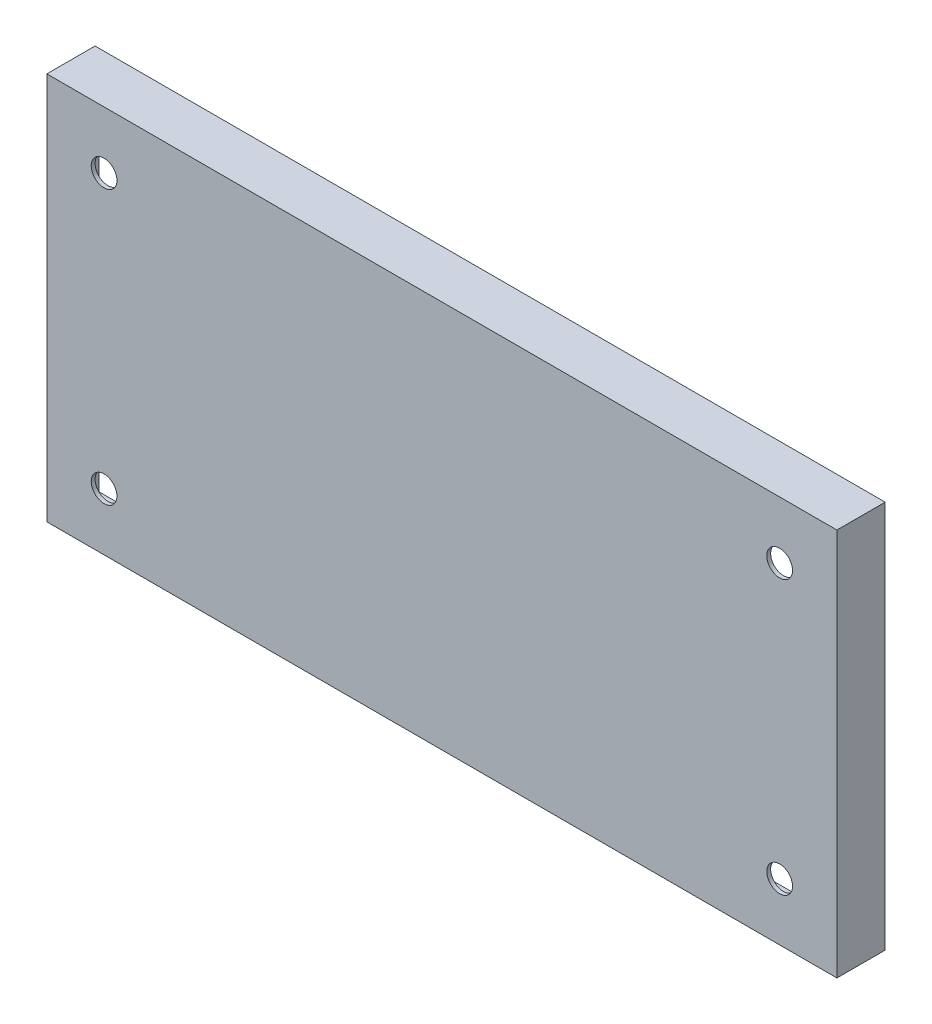
ISO-10303-21;
HEADER;
FILE_DESCRIPTION(('STEP AP214'),'2;1');
FILE_NAME('part.step','',(''),(''),'','','');
FILE_SCHEMA(('AUTOMOTIVE_DESIGN { 1 0 10303 214 1 1 1 1 }'));
ENDSEC;
DATA;
#1=APPLICATION_CONTEXT('core data for automotive mechanical design processes');
#2=APPLICATION_PROTOCOL_DEFINITION('international standard','automotive_design',2000,#1);
#3=PRODUCT_CONTEXT('',#1,'mechanical');
#4=PRODUCT('Part','Part','',(#3));
#5=PRODUCT_RELATED_PRODUCT_CATEGORY('part','',(#4));
#6=PRODUCT_DEFINITION_FORMATION('','',#4);
#7=PRODUCT_DEFINITION_CONTEXT('part definition',#1,'design');
#8=PRODUCT_DEFINITION('design','',#6,#7);
#9=PRODUCT_DEFINITION_SHAPE('','',#8);
#10=(LENGTH_UNIT() NAMED_UNIT(*) SI_UNIT(.MILLI.,.METRE.));
#11=(NAMED_UNIT(*) PLANE_ANGLE_UNIT() SI_UNIT($,.RADIAN.));
#12=(NAMED_UNIT(*) SI_UNIT($,.STERADIAN.) SOLID_ANGLE_UNIT());
#13=UNCERTAINTY_MEASURE_WITH_UNIT(LENGTH_MEASURE(1.E-05),#10,'distance_accuracy_value','');
#14=(GEOMETRIC_REPRESENTATION_CONTEXT(3) GLOBAL_UNCERTAINTY_ASSIGNED_CONTEXT((#13)) GLOBAL_UNIT_ASSIGNED_CONTEXT((#10,
#11,#12)) REPRESENTATION_CONTEXT('',''));
#15=CARTESIAN_POINT('',(0.,0.,0.));
#16=DIRECTION('',(0.,0.,1.));
#17=DIRECTION('',(1.,0.,0.));
#18=AXIS2_PLACEMENT_3D('',#15,#16,#17);
#19=CARTESIAN_POINT('',(-122.8,-60.3,15.));
#20=DIRECTION('',(0.,1.,0.));
#21=DIRECTION('',(-1.,0.,0.));
#22=AXIS2_PLACEMENT_3D('',#19,#20,#21);
#23=PLANE('',#22);
#24=DIRECTION('',(1.,0.,0.));
#25=VECTOR('',#24,1.);
#26=CARTESIAN_POINT('',(-122.8,-60.3,0.));
#27=LINE('',#26,#25);
#28=CARTESIAN_POINT('',(-122.8,-60.3,0.));
#29=VERTEX_POINT('',#28);
#30=CARTESIAN_POINT('',(122.8,-60.3,0.));
#31=VERTEX_POINT('',#30);
#32=EDGE_CURVE('E135',#29,#31,#27,.T.);
#33=ORIENTED_EDGE('',*,*,#32,.T.);
#34=DIRECTION('',(0.,0.,-1.));
#35=VECTOR('',#34,1.);
#36=CARTESIAN_POINT('',(122.8,-60.3,15.));
#37=LINE('',#36,#35);
#38=CARTESIAN_POINT('',(122.8,-60.3,15.));
#39=VERTEX_POINT('',#38);
#40=EDGE_CURVE('E11',#39,#31,#37,.T.);
#41=ORIENTED_EDGE('',*,*,#40,.F.);
#42=DIRECTION('',(1.,0.,0.));
#43=VECTOR('',#42,1.);
#44=CARTESIAN_POINT('',(-122.8,-60.3,15.));
#45=LINE('',#44,#43);
#46=CARTESIAN_POINT('',(-122.8,-60.3,15.));
#47=VERTEX_POINT('',#46);
#48=EDGE_CURVE('E159',#47,#39,#45,.T.);
#49=ORIENTED_EDGE('',*,*,#48,.F.);
#50=DIRECTION('',(0.,0.,-1.));
#51=VECTOR('',#50,1.);
#52=CARTESIAN_POINT('',(-122.8,-60.3,15.));
#53=LINE('',#52,#51);
#54=EDGE_CURVE('E164',#47,#29,#53,.T.);
#55=ORIENTED_EDGE('',*,*,#54,.T.);
#56=EDGE_LOOP('',(#33,#41,#49,#55));
#57=FACE_BOUND('',#56,.T.);
#58=ADVANCED_FACE('F37',(#57),#23,.F.);
#59=CARTESIAN_POINT('',(122.8,-60.3,15.));
#60=DIRECTION('',(-1.,0.,0.));
#61=DIRECTION('',(0.,0.,1.));
#62=AXIS2_PLACEMENT_3D('',#59,#60,#61);
#63=PLANE('',#62);
#64=DIRECTION('',(0.,1.,0.));
#65=VECTOR('',#64,1.);
#66=CARTESIAN_POINT('',(122.8,-60.3,0.));
#67=LINE('',#66,#65);
#68=CARTESIAN_POINT('',(122.8,60.3,0.));
#69=VERTEX_POINT('',#68);
#70=EDGE_CURVE('E139',#31,#69,#67,.T.);
#71=ORIENTED_EDGE('',*,*,#70,.T.);
#72=DIRECTION('',(0.,0.,-1.));
#73=VECTOR('',#72,1.);
#74=CARTESIAN_POINT('',(122.8,60.3,15.));
#75=LINE('',#74,#73);
#76=CARTESIAN_POINT('',(122.8,60.3,15.));
#77=VERTEX_POINT('',#76);
#78=EDGE_CURVE('E45',#77,#69,#75,.T.);
#79=ORIENTED_EDGE('',*,*,#78,.F.);
#80=DIRECTION('',(0.,1.,0.));
#81=VECTOR('',#80,1.);
#82=CARTESIAN_POINT('',(122.8,-60.3,15.));
#83=LINE('',#82,#81);
#84=EDGE_CURVE('E90',#39,#77,#83,.T.);
#85=ORIENTED_EDGE('',*,*,#84,.F.);
#86=ORIENTED_EDGE('',*,*,#40,.T.);
#87=EDGE_LOOP('',(#71,#79,#85,#86));
#88=FACE_BOUND('',#87,.T.);
#89=ADVANCED_FACE('F203',(#88),#63,.F.);
#90=CARTESIAN_POINT('',(-122.8,60.3,15.));
#91=DIRECTION('',(0.,-1.,0.));
#92=DIRECTION('',(1.,0.,0.));
#93=AXIS2_PLACEMENT_3D('',#90,#91,#92);
#94=PLANE('',#93);
#95=DIRECTION('',(-1.,0.,0.));
#96=VECTOR('',#95,1.);
#97=CARTESIAN_POINT('',(-122.8,60.3,0.));
#98=LINE('',#97,#96);
#99=CARTESIAN_POINT('',(-122.8,60.3,0.));
#100=VERTEX_POINT('',#99);
#101=EDGE_CURVE('E167',#69,#100,#98,.T.);
#102=ORIENTED_EDGE('',*,*,#101,.T.);
#103=DIRECTION('',(0.,0.,-1.));
#104=VECTOR('',#103,1.);
#105=CARTESIAN_POINT('',(-122.8,60.3,15.));
#106=LINE('',#105,#104);
#107=CARTESIAN_POINT('',(-122.8,60.3,15.));
#108=VERTEX_POINT('',#107);
#109=EDGE_CURVE('E171',#108,#100,#106,.T.);
#110=ORIENTED_EDGE('',*,*,#109,.F.);
#111=DIRECTION('',(-1.,0.,0.));
#112=VECTOR('',#111,1.);
#113=CARTESIAN_POINT('',(-122.8,60.3,15.));
#114=LINE('',#113,#112);
#115=EDGE_CURVE('E162',#77,#108,#114,.T.);
#116=ORIENTED_EDGE('',*,*,#115,.F.);
#117=ORIENTED_EDGE('',*,*,#78,.T.);
#118=EDGE_LOOP('',(#102,#110,#116,#117));
#119=FACE_BOUND('',#118,.T.);
#120=ADVANCED_FACE('F208',(#119),#94,.F.);
#121=CARTESIAN_POINT('',(-122.8,-60.3,15.));
#122=DIRECTION('',(1.,0.,0.));
#123=DIRECTION('',(0.,1.,0.));
#124=AXIS2_PLACEMENT_3D('',#121,#122,#123);
#125=PLANE('',#124);
#126=DIRECTION('',(0.,-1.,0.));
#127=VECTOR('',#126,1.);
#128=CARTESIAN_POINT('',(-122.8,-60.3,0.));
#129=LINE('',#128,#127);
#130=EDGE_CURVE('E83',#100,#29,#129,.T.);
#131=ORIENTED_EDGE('',*,*,#130,.T.);
#132=ORIENTED_EDGE('',*,*,#54,.F.);
#133=DIRECTION('',(0.,-1.,0.));
#134=VECTOR('',#133,1.);
#135=CARTESIAN_POINT('',(-122.8,-60.3,15.));
#136=LINE('',#135,#134);
#137=EDGE_CURVE('E62',#108,#47,#136,.T.);
#138=ORIENTED_EDGE('',*,*,#137,.F.);
#139=ORIENTED_EDGE('',*,*,#109,.T.);
#140=EDGE_LOOP('',(#131,#132,#138,#139));
#141=FACE_BOUND('',#140,.T.);
#142=ADVANCED_FACE('F196',(#141),#125,.F.);
#143=CARTESIAN_POINT('',(0.,0.,15.));
#144=DIRECTION('',(0.,0.,1.));
#145=DIRECTION('',(1.,0.,0.));
#146=AXIS2_PLACEMENT_3D('',#143,#144,#145);
#147=PLANE('',#146);
#148=CARTESIAN_POINT('',(105.,42.5,15.));
#149=DIRECTION('',(0.,0.,1.));
#150=DIRECTION('',(-1.,0.,0.));
#151=AXIS2_PLACEMENT_3D('',#148,#149,#150);
#152=CIRCLE('',#151,4.00000000000001);
#153=CARTESIAN_POINT('',(101.,42.5,15.));
#154=VERTEX_POINT('',#153);
#155=EDGE_CURVE('E180',#154,#154,#152,.T.);
#156=ORIENTED_EDGE('',*,*,#155,.F.);
#157=EDGE_LOOP('',(#156));
#158=FACE_BOUND('',#157,.T.);
#159=CARTESIAN_POINT('',(105.,-42.5,15.));
#160=DIRECTION('',(0.,0.,1.));
#161=DIRECTION('',(1.,0.,0.));
#162=AXIS2_PLACEMENT_3D('',#159,#160,#161);
#163=CIRCLE('',#162,4.00000000000001);
#164=CARTESIAN_POINT('',(109.,-42.5,15.));
#165=VERTEX_POINT('',#164);
#166=EDGE_CURVE('E327',#165,#165,#163,.T.);
#167=ORIENTED_EDGE('',*,*,#166,.F.);
#168=EDGE_LOOP('',(#167));
#169=FACE_BOUND('',#168,.T.);
#170=CARTESIAN_POINT('',(-105.,-42.5,15.));
#171=DIRECTION('',(0.,0.,1.));
#172=DIRECTION('',(-1.,0.,0.));
#173=AXIS2_PLACEMENT_3D('',#170,#171,#172);
#174=CIRCLE('',#173,4.00000000000001);
#175=CARTESIAN_POINT('',(-109.,-42.5,15.));
#176=VERTEX_POINT('',#175);
#177=EDGE_CURVE('E330',#176,#176,#174,.T.);
#178=ORIENTED_EDGE('',*,*,#177,.F.);
#179=EDGE_LOOP('',(#178));
#180=FACE_BOUND('',#179,.T.);
#181=CARTESIAN_POINT('',(-105.,42.5,15.));
#182=DIRECTION('',(0.,0.,1.));
#183=DIRECTION('',(1.,0.,0.));
#184=AXIS2_PLACEMENT_3D('',#181,#182,#183);
#185=CIRCLE('',#184,4.00000000000001);
#186=CARTESIAN_POINT('',(-101.,42.5,15.));
#187=VERTEX_POINT('',#186);
#188=EDGE_CURVE('E144',#187,#187,#185,.T.);
#189=ORIENTED_EDGE('',*,*,#188,.F.);
#190=EDGE_LOOP('',(#189));
#191=FACE_BOUND('',#190,.T.);
#192=ORIENTED_EDGE('',*,*,#48,.T.);
#193=ORIENTED_EDGE('',*,*,#84,.T.);
#194=ORIENTED_EDGE('',*,*,#115,.T.);
#195=ORIENTED_EDGE('',*,*,#137,.T.);
#196=EDGE_LOOP('',(#192,#193,#194,#195));
#197=FACE_BOUND('',#196,.T.);
#198=ADVANCED_FACE('F193',(#158,#169,#180,#191,#197),#147,.T.);
#199=CARTESIAN_POINT('',(0.,0.,0.));
#200=DIRECTION('',(0.,0.,1.));
#201=DIRECTION('',(1.,0.,0.));
#202=AXIS2_PLACEMENT_3D('',#199,#200,#201);
#203=PLANE('',#202);
#204=DIRECTION('',(0.,-1.,0.));
#205=VECTOR('',#204,1.);
#206=CARTESIAN_POINT('',(-121.6,-60.3,0.));
#207=LINE('',#206,#205);
#208=CARTESIAN_POINT('',(-121.6,59.1,0.));
#209=VERTEX_POINT('',#208);
#210=CARTESIAN_POINT('',(-121.6,-59.1,0.));
#211=VERTEX_POINT('',#210);
#212=EDGE_CURVE('E130',#209,#211,#207,.T.);
#213=ORIENTED_EDGE('',*,*,#212,.T.);
#214=DIRECTION('',(1.,0.,0.));
#215=VECTOR('',#214,1.);
#216=CARTESIAN_POINT('',(-122.8,-59.1,0.));
#217=LINE('',#216,#215);
#218=CARTESIAN_POINT('',(121.6,-59.1,0.));
#219=VERTEX_POINT('',#218);
#220=EDGE_CURVE('E152',#211,#219,#217,.T.);
#221=ORIENTED_EDGE('',*,*,#220,.T.);
#222=DIRECTION('',(0.,1.,0.));
#223=VECTOR('',#222,1.);
#224=CARTESIAN_POINT('',(121.6,-60.3,0.));
#225=LINE('',#224,#223);
#226=CARTESIAN_POINT('',(121.6,59.1,0.));
#227=VERTEX_POINT('',#226);
#228=EDGE_CURVE('E134',#219,#227,#225,.T.);
#229=ORIENTED_EDGE('',*,*,#228,.T.);
#230=DIRECTION('',(-1.,0.,0.));
#231=VECTOR('',#230,1.);
#232=CARTESIAN_POINT('',(-122.8,59.1,0.));
#233=LINE('',#232,#231);
#234=EDGE_CURVE('E53',#227,#209,#233,.T.);
#235=ORIENTED_EDGE('',*,*,#234,.T.);
#236=EDGE_LOOP('',(#213,#221,#229,#235));
#237=FACE_BOUND('',#236,.T.);
#238=ORIENTED_EDGE('',*,*,#32,.F.);
#239=ORIENTED_EDGE('',*,*,#130,.F.);
#240=ORIENTED_EDGE('',*,*,#101,.F.);
#241=ORIENTED_EDGE('',*,*,#70,.F.);
#242=EDGE_LOOP('',(#238,#239,#240,#241));
#243=FACE_BOUND('',#242,.T.);
#244=ADVANCED_FACE('F195',(#237,#243),#203,.F.);
#245=CARTESIAN_POINT('',(-122.8,-59.1,15.));
#246=DIRECTION('',(0.,1.,0.));
#247=DIRECTION('',(-1.,0.,0.));
#248=AXIS2_PLACEMENT_3D('',#245,#246,#247);
#249=PLANE('',#248);
#250=ORIENTED_EDGE('',*,*,#220,.F.);
#251=DIRECTION('',(0.,0.,-1.));
#252=VECTOR('',#251,1.);
#253=CARTESIAN_POINT('',(-121.6,-59.1,15.));
#254=LINE('',#253,#252);
#255=CARTESIAN_POINT('',(-121.6,-59.1,13.8));
#256=VERTEX_POINT('',#255);
#257=EDGE_CURVE('E129',#256,#211,#254,.T.);
#258=ORIENTED_EDGE('',*,*,#257,.F.);
#259=DIRECTION('',(1.,0.,0.));
#260=VECTOR('',#259,1.);
#261=CARTESIAN_POINT('',(-122.8,-59.1,13.8));
#262=LINE('',#261,#260);
#263=CARTESIAN_POINT('',(121.6,-59.1,13.8));
#264=VERTEX_POINT('',#263);
#265=EDGE_CURVE('E117',#256,#264,#262,.T.);
#266=ORIENTED_EDGE('',*,*,#265,.T.);
#267=DIRECTION('',(0.,0.,-1.));
#268=VECTOR('',#267,1.);
#269=CARTESIAN_POINT('',(121.6,-59.1,15.));
#270=LINE('',#269,#268);
#271=EDGE_CURVE('E127',#264,#219,#270,.T.);
#272=ORIENTED_EDGE('',*,*,#271,.T.);
#273=EDGE_LOOP('',(#250,#258,#266,#272));
#274=FACE_BOUND('',#273,.T.);
#275=ADVANCED_FACE('F126',(#274),#249,.T.);
#276=CARTESIAN_POINT('',(121.6,-60.3,15.));
#277=DIRECTION('',(-1.,0.,0.));
#278=DIRECTION('',(0.,0.,1.));
#279=AXIS2_PLACEMENT_3D('',#276,#277,#278);
#280=PLANE('',#279);
#281=ORIENTED_EDGE('',*,*,#228,.F.);
#282=ORIENTED_EDGE('',*,*,#271,.F.);
#283=DIRECTION('',(0.,1.,0.));
#284=VECTOR('',#283,1.);
#285=CARTESIAN_POINT('',(121.6,-60.3,13.8));
#286=LINE('',#285,#284);
#287=CARTESIAN_POINT('',(121.6,59.1,13.8));
#288=VERTEX_POINT('',#287);
#289=EDGE_CURVE('E113',#264,#288,#286,.T.);
#290=ORIENTED_EDGE('',*,*,#289,.T.);
#291=DIRECTION('',(0.,0.,-1.));
#292=VECTOR('',#291,1.);
#293=CARTESIAN_POINT('',(121.6,59.1,15.));
#294=LINE('',#293,#292);
#295=EDGE_CURVE('E136',#288,#227,#294,.T.);
#296=ORIENTED_EDGE('',*,*,#295,.T.);
#297=EDGE_LOOP('',(#281,#282,#290,#296));
#298=FACE_BOUND('',#297,.T.);
#299=ADVANCED_FACE('F132',(#298),#280,.T.);
#300=CARTESIAN_POINT('',(-122.8,59.1,15.));
#301=DIRECTION('',(0.,-1.,0.));
#302=DIRECTION('',(1.,0.,0.));
#303=AXIS2_PLACEMENT_3D('',#300,#301,#302);
#304=PLANE('',#303);
#305=ORIENTED_EDGE('',*,*,#234,.F.);
#306=ORIENTED_EDGE('',*,*,#295,.F.);
#307=DIRECTION('',(-1.,0.,0.));
#308=VECTOR('',#307,1.);
#309=CARTESIAN_POINT('',(-122.8,59.1,13.8));
#310=LINE('',#309,#308);
#311=CARTESIAN_POINT('',(-121.6,59.1,13.8));
#312=VERTEX_POINT('',#311);
#313=EDGE_CURVE('E118',#288,#312,#310,.T.);
#314=ORIENTED_EDGE('',*,*,#313,.T.);
#315=DIRECTION('',(0.,0.,-1.));
#316=VECTOR('',#315,1.);
#317=CARTESIAN_POINT('',(-121.6,59.1,15.));
#318=LINE('',#317,#316);
#319=EDGE_CURVE('E141',#312,#209,#318,.T.);
#320=ORIENTED_EDGE('',*,*,#319,.T.);
#321=EDGE_LOOP('',(#305,#306,#314,#320));
#322=FACE_BOUND('',#321,.T.);
#323=ADVANCED_FACE('F297',(#322),#304,.T.);
#324=CARTESIAN_POINT('',(-121.6,-60.3,15.));
#325=DIRECTION('',(1.,0.,0.));
#326=DIRECTION('',(0.,1.,0.));
#327=AXIS2_PLACEMENT_3D('',#324,#325,#326);
#328=PLANE('',#327);
#329=ORIENTED_EDGE('',*,*,#212,.F.);
#330=ORIENTED_EDGE('',*,*,#319,.F.);
#331=DIRECTION('',(0.,-1.,0.));
#332=VECTOR('',#331,1.);
#333=CARTESIAN_POINT('',(-121.6,-60.3,13.8));
#334=LINE('',#333,#332);
#335=EDGE_CURVE('E147',#312,#256,#334,.T.);
#336=ORIENTED_EDGE('',*,*,#335,.T.);
#337=ORIENTED_EDGE('',*,*,#257,.T.);
#338=EDGE_LOOP('',(#329,#330,#336,#337));
#339=FACE_BOUND('',#338,.T.);
#340=ADVANCED_FACE('F242',(#339),#328,.T.);
#341=CARTESIAN_POINT('',(0.,0.,13.8));
#342=DIRECTION('',(0.,0.,1.));
#343=DIRECTION('',(1.,0.,0.));
#344=AXIS2_PLACEMENT_3D('',#341,#342,#343);
#345=PLANE('',#344);
#346=CARTESIAN_POINT('',(105.,42.5,13.8));
#347=DIRECTION('',(0.,0.,1.));
#348=DIRECTION('',(1.,0.,0.));
#349=AXIS2_PLACEMENT_3D('',#346,#347,#348);
#350=CIRCLE('',#349,4.00000000000001);
#351=CARTESIAN_POINT('',(109.,42.5,13.8));
#352=VERTEX_POINT('',#351);
#353=EDGE_CURVE('E40',#352,#352,#350,.T.);
#354=ORIENTED_EDGE('',*,*,#353,.T.);
#355=EDGE_LOOP('',(#354));
#356=FACE_BOUND('',#355,.T.);
#357=CARTESIAN_POINT('',(105.,-42.5,13.8));
#358=DIRECTION('',(0.,0.,1.));
#359=DIRECTION('',(1.,0.,0.));
#360=AXIS2_PLACEMENT_3D('',#357,#358,#359);
#361=CIRCLE('',#360,4.00000000000001);
#362=CARTESIAN_POINT('',(109.,-42.5,13.8));
#363=VERTEX_POINT('',#362);
#364=EDGE_CURVE('E179',#363,#363,#361,.T.);
#365=ORIENTED_EDGE('',*,*,#364,.T.);
#366=EDGE_LOOP('',(#365));
#367=FACE_BOUND('',#366,.T.);
#368=CARTESIAN_POINT('',(-105.,-42.5,13.8));
#369=DIRECTION('',(0.,0.,1.));
#370=DIRECTION('',(1.,0.,0.));
#371=AXIS2_PLACEMENT_3D('',#368,#369,#370);
#372=CIRCLE('',#371,4.00000000000001);
#373=CARTESIAN_POINT('',(-101.,-42.5,13.8));
#374=VERTEX_POINT('',#373);
#375=EDGE_CURVE('E177',#374,#374,#372,.T.);
#376=ORIENTED_EDGE('',*,*,#375,.T.);
#377=EDGE_LOOP('',(#376));
#378=FACE_BOUND('',#377,.T.);
#379=CARTESIAN_POINT('',(-105.,42.5,13.8));
#380=DIRECTION('',(0.,0.,1.));
#381=DIRECTION('',(1.,0.,0.));
#382=AXIS2_PLACEMENT_3D('',#379,#380,#381);
#383=CIRCLE('',#382,4.00000000000001);
#384=CARTESIAN_POINT('',(-101.,42.5,13.8));
#385=VERTEX_POINT('',#384);
#386=EDGE_CURVE('E154',#385,#385,#383,.T.);
#387=ORIENTED_EDGE('',*,*,#386,.T.);
#388=EDGE_LOOP('',(#387));
#389=FACE_BOUND('',#388,.T.);
#390=ORIENTED_EDGE('',*,*,#265,.F.);
#391=ORIENTED_EDGE('',*,*,#335,.F.);
#392=ORIENTED_EDGE('',*,*,#313,.F.);
#393=ORIENTED_EDGE('',*,*,#289,.F.);
#394=EDGE_LOOP('',(#390,#391,#392,#393));
#395=FACE_BOUND('',#394,.T.);
#396=ADVANCED_FACE('F115',(#356,#367,#378,#389,#395),#345,.F.);
#397=CARTESIAN_POINT('',(-105.,42.5,0.));
#398=DIRECTION('',(0.,0.,1.));
#399=DIRECTION('',(1.,0.,0.));
#400=AXIS2_PLACEMENT_3D('',#397,#398,#399);
#401=CYLINDRICAL_SURFACE('',#400,4.00000000000001);
#402=ORIENTED_EDGE('',*,*,#188,.T.);
#403=EDGE_LOOP('',(#402));
#404=FACE_BOUND('',#403,.T.);
#405=ORIENTED_EDGE('',*,*,#386,.F.);
#406=EDGE_LOOP('',(#405));
#407=FACE_BOUND('',#406,.T.);
#408=ADVANCED_FACE('F190',(#404,#407),#401,.F.);
#409=CARTESIAN_POINT('',(-105.,-42.5,0.));
#410=DIRECTION('',(0.,0.,1.));
#411=DIRECTION('',(1.,0.,0.));
#412=AXIS2_PLACEMENT_3D('',#409,#410,#411);
#413=CYLINDRICAL_SURFACE('',#412,4.00000000000001);
#414=ORIENTED_EDGE('',*,*,#177,.T.);
#415=EDGE_LOOP('',(#414));
#416=FACE_BOUND('',#415,.T.);
#417=ORIENTED_EDGE('',*,*,#375,.F.);
#418=EDGE_LOOP('',(#417));
#419=FACE_BOUND('',#418,.T.);
#420=ADVANCED_FACE('F259',(#416,#419),#413,.F.);
#421=CARTESIAN_POINT('',(105.,-42.5,0.));
#422=DIRECTION('',(0.,0.,1.));
#423=DIRECTION('',(1.,0.,0.));
#424=AXIS2_PLACEMENT_3D('',#421,#422,#423);
#425=CYLINDRICAL_SURFACE('',#424,4.00000000000001);
#426=ORIENTED_EDGE('',*,*,#166,.T.);
#427=EDGE_LOOP('',(#426));
#428=FACE_BOUND('',#427,.T.);
#429=ORIENTED_EDGE('',*,*,#364,.F.);
#430=EDGE_LOOP('',(#429));
#431=FACE_BOUND('',#430,.T.);
#432=ADVANCED_FACE('F268',(#428,#431),#425,.F.);
#433=CARTESIAN_POINT('',(105.,42.5,0.));
#434=DIRECTION('',(0.,0.,1.));
#435=DIRECTION('',(1.,0.,0.));
#436=AXIS2_PLACEMENT_3D('',#433,#434,#435);
#437=CYLINDRICAL_SURFACE('',#436,4.00000000000001);
#438=ORIENTED_EDGE('',*,*,#155,.T.);
#439=EDGE_LOOP('',(#438));
#440=FACE_BOUND('',#439,.T.);
#441=ORIENTED_EDGE('',*,*,#353,.F.);
#442=EDGE_LOOP('',(#441));
#443=FACE_BOUND('',#442,.T.);
#444=ADVANCED_FACE('F278',(#440,#443),#437,.F.);
#445=CLOSED_SHELL('',(#58,#89,#120,#142,#198,#244,#275,#299,#323,#340,#396,#408,#420,#432,#444));
#446=MANIFOLD_SOLID_BREP('B2',#445);
#447=ADVANCED_BREP_SHAPE_REPRESENTATION('',(#18,#446),#14);
#448=SHAPE_DEFINITION_REPRESENTATION(#9,#447);
ENDSEC;
END-ISO-10303-21;
